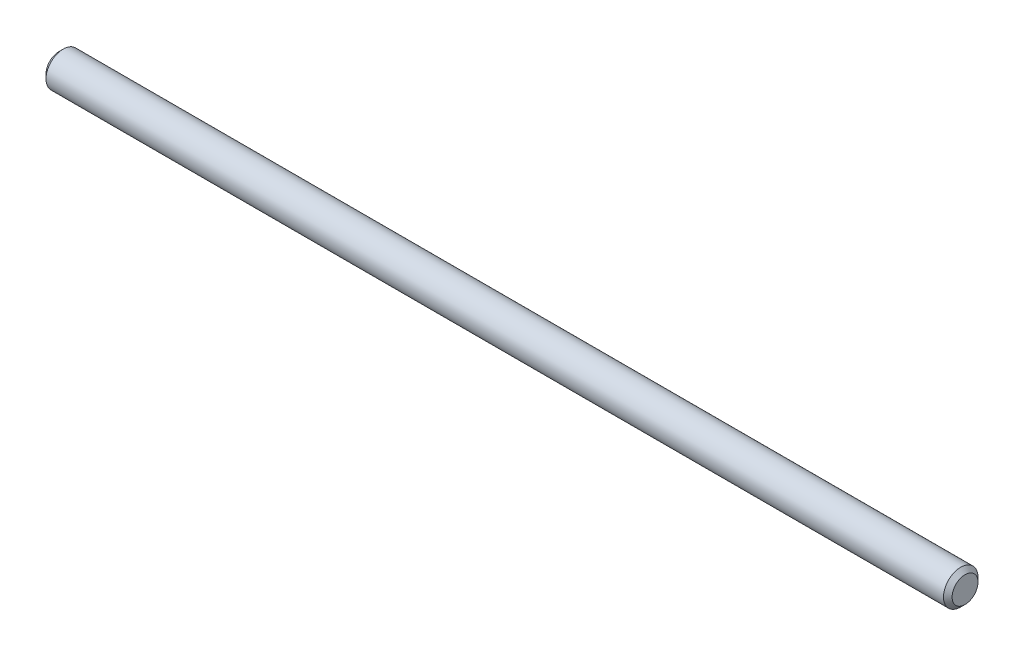
ISO-10303-21;
HEADER;
FILE_DESCRIPTION(('STEP AP214'),'2;1');
FILE_NAME('part.step','',(''),(''),'','','');
FILE_SCHEMA(('AUTOMOTIVE_DESIGN { 1 0 10303 214 1 1 1 1 }'));
ENDSEC;
DATA;
#1=APPLICATION_CONTEXT('core data for automotive mechanical design processes');
#2=APPLICATION_PROTOCOL_DEFINITION('international standard','automotive_design',2000,#1);
#3=PRODUCT_CONTEXT('',#1,'mechanical');
#4=PRODUCT('Part','Part','',(#3));
#5=PRODUCT_RELATED_PRODUCT_CATEGORY('part','',(#4));
#6=PRODUCT_DEFINITION_FORMATION('','',#4);
#7=PRODUCT_DEFINITION_CONTEXT('part definition',#1,'design');
#8=PRODUCT_DEFINITION('design','',#6,#7);
#9=PRODUCT_DEFINITION_SHAPE('','',#8);
#10=(LENGTH_UNIT() NAMED_UNIT(*) SI_UNIT(.MILLI.,.METRE.));
#11=(NAMED_UNIT(*) PLANE_ANGLE_UNIT() SI_UNIT($,.RADIAN.));
#12=(NAMED_UNIT(*) SI_UNIT($,.STERADIAN.) SOLID_ANGLE_UNIT());
#13=UNCERTAINTY_MEASURE_WITH_UNIT(LENGTH_MEASURE(1.E-05),#10,'distance_accuracy_value','');
#14=(GEOMETRIC_REPRESENTATION_CONTEXT(3) GLOBAL_UNCERTAINTY_ASSIGNED_CONTEXT((#13)) GLOBAL_UNIT_ASSIGNED_CONTEXT((#10,
#11,#12)) REPRESENTATION_CONTEXT('',''));
#15=CARTESIAN_POINT('',(0.,0.,0.));
#16=DIRECTION('',(0.,0.,1.));
#17=DIRECTION('',(1.,0.,0.));
#18=AXIS2_PLACEMENT_3D('',#15,#16,#17);
#19=CARTESIAN_POINT('',(52.5,0.,0.));
#20=DIRECTION('',(-1.,0.,0.));
#21=DIRECTION('',(0.,0.,1.));
#22=AXIS2_PLACEMENT_3D('',#19,#20,#21);
#23=CYLINDRICAL_SURFACE('',#22,2.);
#24=CARTESIAN_POINT('',(52.,0.,0.));
#25=DIRECTION('',(1.,0.,0.));
#26=DIRECTION('',(0.,0.,-1.));
#27=AXIS2_PLACEMENT_3D('',#24,#25,#26);
#28=CIRCLE('',#27,2.);
#29=CARTESIAN_POINT('',(52.,0.,-2.));
#30=VERTEX_POINT('',#29);
#31=EDGE_CURVE('E41',#30,#30,#28,.F.);
#32=ORIENTED_EDGE('',*,*,#31,.T.);
#33=EDGE_LOOP('',(#32));
#34=FACE_BOUND('',#33,.T.);
#35=CARTESIAN_POINT('',(-52.,0.,0.));
#36=DIRECTION('',(1.,0.,0.));
#37=DIRECTION('',(0.,0.,-1.));
#38=AXIS2_PLACEMENT_3D('',#35,#36,#37);
#39=CIRCLE('',#38,2.);
#40=CARTESIAN_POINT('',(-52.,0.,-2.));
#41=VERTEX_POINT('',#40);
#42=EDGE_CURVE('E45',#41,#41,#39,.T.);
#43=ORIENTED_EDGE('',*,*,#42,.T.);
#44=EDGE_LOOP('',(#43));
#45=FACE_BOUND('',#44,.T.);
#46=ADVANCED_FACE('F34',(#34,#45),#23,.T.);
#47=CARTESIAN_POINT('',(52.5,0.,0.));
#48=DIRECTION('',(1.,0.,0.));
#49=DIRECTION('',(0.,0.,-1.));
#50=AXIS2_PLACEMENT_3D('',#47,#48,#49);
#51=PLANE('',#50);
#52=CARTESIAN_POINT('',(52.5,0.,0.));
#53=DIRECTION('',(1.,0.,0.));
#54=DIRECTION('',(0.,0.,-1.));
#55=AXIS2_PLACEMENT_3D('',#52,#53,#54);
#56=CIRCLE('',#55,1.5);
#57=CARTESIAN_POINT('',(52.5,0.,-1.5));
#58=VERTEX_POINT('',#57);
#59=EDGE_CURVE('E49',#58,#58,#56,.T.);
#60=ORIENTED_EDGE('',*,*,#59,.T.);
#61=EDGE_LOOP('',(#60));
#62=FACE_BOUND('',#61,.T.);
#63=ADVANCED_FACE('F55',(#62),#51,.T.);
#64=CARTESIAN_POINT('',(-52.5,0.,0.));
#65=DIRECTION('',(1.,0.,0.));
#66=DIRECTION('',(0.,0.,-1.));
#67=AXIS2_PLACEMENT_3D('',#64,#65,#66);
#68=PLANE('',#67);
#69=CARTESIAN_POINT('',(-52.5,0.,0.));
#70=DIRECTION('',(1.,0.,0.));
#71=DIRECTION('',(0.,0.,-1.));
#72=AXIS2_PLACEMENT_3D('',#69,#70,#71);
#73=CIRCLE('',#72,1.5);
#74=CARTESIAN_POINT('',(-52.5,0.,-1.5));
#75=VERTEX_POINT('',#74);
#76=EDGE_CURVE('E10',#75,#75,#73,.F.);
#77=ORIENTED_EDGE('',*,*,#76,.T.);
#78=EDGE_LOOP('',(#77));
#79=FACE_BOUND('',#78,.T.);
#80=ADVANCED_FACE('F59',(#79),#68,.F.);
#81=CARTESIAN_POINT('',(52.5,0.,0.));
#82=DIRECTION('',(-1.,0.,0.));
#83=DIRECTION('',(0.,0.,1.));
#84=AXIS2_PLACEMENT_3D('',#81,#82,#83);
#85=CONICAL_SURFACE('',#84,1.5,0.785398163397453);
#86=ORIENTED_EDGE('',*,*,#31,.F.);
#87=EDGE_LOOP('',(#86));
#88=FACE_BOUND('',#87,.T.);
#89=ORIENTED_EDGE('',*,*,#59,.F.);
#90=EDGE_LOOP('',(#89));
#91=FACE_BOUND('',#90,.T.);
#92=ADVANCED_FACE('F57',(#88,#91),#85,.T.);
#93=CARTESIAN_POINT('',(-52.,0.,0.));
#94=DIRECTION('',(1.,0.,0.));
#95=DIRECTION('',(0.,0.,-1.));
#96=AXIS2_PLACEMENT_3D('',#93,#94,#95);
#97=CONICAL_SURFACE('',#96,2.,0.785398163397432);
#98=ORIENTED_EDGE('',*,*,#76,.F.);
#99=EDGE_LOOP('',(#98));
#100=FACE_BOUND('',#99,.T.);
#101=ORIENTED_EDGE('',*,*,#42,.F.);
#102=EDGE_LOOP('',(#101));
#103=FACE_BOUND('',#102,.T.);
#104=ADVANCED_FACE('F36',(#100,#103),#97,.T.);
#105=CLOSED_SHELL('',(#46,#63,#80,#92,#104));
#106=MANIFOLD_SOLID_BREP('B2',#105);
#107=ADVANCED_BREP_SHAPE_REPRESENTATION('',(#18,#106),#14);
#108=SHAPE_DEFINITION_REPRESENTATION(#9,#107);
ENDSEC;
END-ISO-10303-21;
